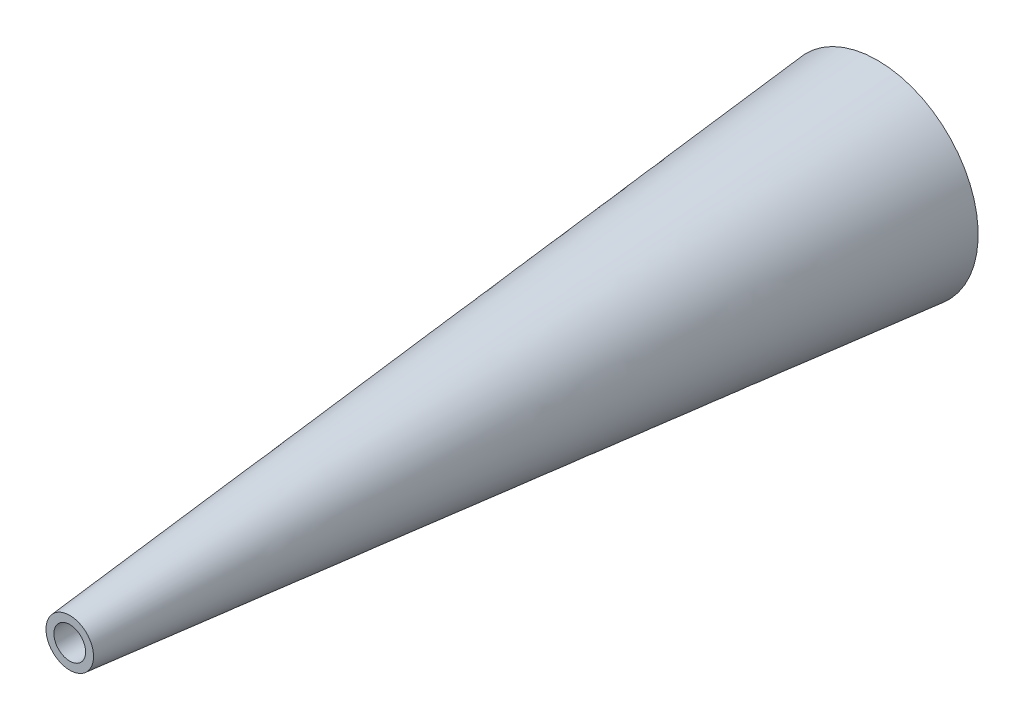
ISO-10303-21;
HEADER;
FILE_DESCRIPTION(('STEP AP214'),'2;1');
FILE_NAME('part.step','',(''),(''),'','','');
FILE_SCHEMA(('AUTOMOTIVE_DESIGN { 1 0 10303 214 1 1 1 1 }'));
ENDSEC;
DATA;
#1=APPLICATION_CONTEXT('core data for automotive mechanical design processes');
#2=APPLICATION_PROTOCOL_DEFINITION('international standard','automotive_design',2000,#1);
#3=PRODUCT_CONTEXT('',#1,'mechanical');
#4=PRODUCT('Part','Part','',(#3));
#5=PRODUCT_RELATED_PRODUCT_CATEGORY('part','',(#4));
#6=PRODUCT_DEFINITION_FORMATION('','',#4);
#7=PRODUCT_DEFINITION_CONTEXT('part definition',#1,'design');
#8=PRODUCT_DEFINITION('design','',#6,#7);
#9=PRODUCT_DEFINITION_SHAPE('','',#8);
#10=(LENGTH_UNIT() NAMED_UNIT(*) SI_UNIT(.MILLI.,.METRE.));
#11=(NAMED_UNIT(*) PLANE_ANGLE_UNIT() SI_UNIT($,.RADIAN.));
#12=(NAMED_UNIT(*) SI_UNIT($,.STERADIAN.) SOLID_ANGLE_UNIT());
#13=UNCERTAINTY_MEASURE_WITH_UNIT(LENGTH_MEASURE(1.E-05),#10,'distance_accuracy_value','');
#14=(GEOMETRIC_REPRESENTATION_CONTEXT(3) GLOBAL_UNCERTAINTY_ASSIGNED_CONTEXT((#13)) GLOBAL_UNIT_ASSIGNED_CONTEXT((#10,
#11,#12)) REPRESENTATION_CONTEXT('',''));
#15=CARTESIAN_POINT('',(0.,0.,0.));
#16=DIRECTION('',(0.,0.,1.));
#17=DIRECTION('',(1.,0.,0.));
#18=AXIS2_PLACEMENT_3D('',#15,#16,#17);
#19=CARTESIAN_POINT('',(0.,0.,203.656132651637));
#20=DIRECTION('',(0.,0.,1.));
#21=DIRECTION('',(1.,0.,0.));
#22=AXIS2_PLACEMENT_3D('',#19,#20,#21);
#23=PLANE('',#22);
#24=CARTESIAN_POINT('',(0.,0.,203.656132651637));
#25=DIRECTION('',(0.,0.,1.));
#26=DIRECTION('',(1.,0.,0.));
#27=AXIS2_PLACEMENT_3D('',#24,#25,#26);
#28=CIRCLE('',#27,8.);
#29=CARTESIAN_POINT('',(8.,0.,203.656132651637));
#30=VERTEX_POINT('',#29);
#31=EDGE_CURVE('E102',#30,#30,#28,.T.);
#32=ORIENTED_EDGE('',*,*,#31,.F.);
#33=EDGE_LOOP('',(#32));
#34=FACE_BOUND('',#33,.T.);
#35=CARTESIAN_POINT('',(0.,0.,203.656132651637));
#36=DIRECTION('',(0.,0.,1.));
#37=DIRECTION('',(1.,0.,0.));
#38=AXIS2_PLACEMENT_3D('',#35,#36,#37);
#39=CIRCLE('',#38,11.9893942221651);
#40=CARTESIAN_POINT('',(0.,11.9893942221651,203.656132651637));
#41=VERTEX_POINT('',#40);
#42=EDGE_CURVE('E12',#41,#41,#39,.T.);
#43=ORIENTED_EDGE('',*,*,#42,.T.);
#44=EDGE_LOOP('',(#43));
#45=FACE_BOUND('',#44,.T.);
#46=ADVANCED_FACE('F89',(#34,#45),#23,.T.);
#47=CARTESIAN_POINT('',(0.,0.,-203.656132651637));
#48=DIRECTION('',(0.,0.,1.));
#49=DIRECTION('',(1.,0.,0.));
#50=AXIS2_PLACEMENT_3D('',#47,#48,#49);
#51=PLANE('',#50);
#52=CARTESIAN_POINT('',(0.,0.,-203.656132651637));
#53=DIRECTION('',(0.,0.,-1.));
#54=DIRECTION('',(-1.,0.,0.));
#55=AXIS2_PLACEMENT_3D('',#52,#53,#54);
#56=CIRCLE('',#55,8.);
#57=CARTESIAN_POINT('',(-8.,0.,-203.656132651637));
#58=VERTEX_POINT('',#57);
#59=EDGE_CURVE('E165',#58,#58,#56,.T.);
#60=ORIENTED_EDGE('',*,*,#59,.F.);
#61=EDGE_LOOP('',(#60));
#62=FACE_BOUND('',#61,.T.);
#63=CARTESIAN_POINT('',(0.,0.,-203.656132651637));
#64=DIRECTION('',(0.,0.,1.));
#65=DIRECTION('',(1.,0.,0.));
#66=AXIS2_PLACEMENT_3D('',#63,#64,#65);
#67=CIRCLE('',#66,50.7591243536464);
#68=CARTESIAN_POINT('',(0.,50.7591243536464,-203.656132651637));
#69=VERTEX_POINT('',#68);
#70=EDGE_CURVE('E97',#69,#69,#67,.T.);
#71=ORIENTED_EDGE('',*,*,#70,.F.);
#72=EDGE_LOOP('',(#71));
#73=FACE_BOUND('',#72,.T.);
#74=ADVANCED_FACE('F121',(#62,#73),#51,.F.);
#75=CARTESIAN_POINT('',(0.,50.7591243536464,-203.656132651637));
#76=CARTESIAN_POINT('',(0.,37.8358809764859,-67.8853775505457));
#77=CARTESIAN_POINT('',(0.,24.9126375993255,67.8853775505456));
#78=CARTESIAN_POINT('',(0.,11.9893942221651,203.656132651637));
#79=CARTESIAN_POINT('',(-3.32217689374067,50.7591243536464,-203.656132651637));
#80=CARTESIAN_POINT('',(-2.47635259936028,37.8358809764859,-67.8853775505457));
#81=CARTESIAN_POINT('',(-1.63052830497989,24.9126375993255,67.8853775505456));
#82=CARTESIAN_POINT('',(-0.784704010599492,11.9893942221651,203.656132651637));
#83=CARTESIAN_POINT('',(-9.96645070870319,50.1049043488235,-203.656132651637));
#84=CARTESIAN_POINT('',(-7.42896380621113,37.3477731122388,-67.8853775505455));
#85=CARTESIAN_POINT('',(-4.89147690371907,24.590641875654,67.8853775505457));
#86=CARTESIAN_POINT('',(-2.35399000122702,11.8335106390693,203.656132651637));
#87=CARTESIAN_POINT('',(-19.5499718544848,47.1976657180629,-203.656132651637));
#88=CARTESIAN_POINT('',(-14.5727098239404,35.1815667560476,-67.8853775505456));
#89=CARTESIAN_POINT('',(-9.59544779339609,23.1654677940324,67.8853775505457));
#90=CARTESIAN_POINT('',(-4.61818576285176,11.1493688320171,203.656132651637));
#91=CARTESIAN_POINT('',(-28.3821056739208,42.476829874574,-203.656132651637));
#92=CARTESIAN_POINT('',(-21.1558308384665,31.6619682195277,-67.8853775505456));
#93=CARTESIAN_POINT('',(-13.9295560030121,20.8471065644813,67.8853775505456));
#94=CARTESIAN_POINT('',(-6.70328116755781,10.032244909435,203.656132651637));
#95=CARTESIAN_POINT('',(-36.1235715251465,36.1235478487174,-203.656132651637));
#96=CARTESIAN_POINT('',(-26.9268056746517,26.9267591093415,-67.8853775505459));
#97=CARTESIAN_POINT('',(-17.7300398241569,17.7299703699656,67.8853775505454));
#98=CARTESIAN_POINT('',(-8.53327397366214,8.53318163058977,203.656132651637));
#99=CARTESIAN_POINT('',(-42.4768159509501,28.3821070421007,-203.656132651637));
#100=CARTESIAN_POINT('',(-31.6619312804607,21.1558119463166,-67.8853775505455));
#101=CARTESIAN_POINT('',(-20.8470466099712,13.9295168505325,67.8853775505456));
#102=CARTESIAN_POINT('',(-10.0321619394817,6.70322175474844,203.656132651637));
#103=CARTESIAN_POINT('',(-47.1977115756533,19.5499292378348,-203.656132651637));
#104=CARTESIAN_POINT('',(-35.1815484360275,14.5726824673708,-67.885377550546));
#105=CARTESIAN_POINT('',(-23.1653852964017,9.59543569690677,67.8853775505454));
#106=CARTESIAN_POINT('',(-11.1492221567759,4.61818892644276,203.656132651637));
#107=CARTESIAN_POINT('',(-50.104821550738,9.96647101773351,-203.656132651637));
#108=CARTESIAN_POINT('',(-37.3477916062599,7.42894960855719,-67.8853775505455));
#109=CARTESIAN_POINT('',(-24.5907616617819,4.89142819938086,67.8853775505457));
#110=CARTESIAN_POINT('',(-11.8337317173039,2.35390679020452,203.656132651637));
#111=CARTESIAN_POINT('',(-51.0864346358612,1.00613961606655E-13,-203.656132651637));
#112=CARTESIAN_POINT('',(-38.0802393683663,0.,-67.8853775505456));
#113=CARTESIAN_POINT('',(-25.0740441008713,0.,67.8853775505458));
#114=CARTESIAN_POINT('',(-12.0678488333764,0.,203.656132651637));
#115=CARTESIAN_POINT('',(-50.1048215507379,-9.96647101773343,-203.656132651637));
#116=CARTESIAN_POINT('',(-37.3477916062599,-7.42894960855712,-67.8853775505458));
#117=CARTESIAN_POINT('',(-24.5907616617819,-4.89142819938082,67.8853775505455));
#118=CARTESIAN_POINT('',(-11.8337317173039,-2.35390679020451,203.656132651637));
#119=CARTESIAN_POINT('',(-47.1977115756535,-19.5499292378346,-203.656132651637));
#120=CARTESIAN_POINT('',(-35.1815484360276,-14.5726824673707,-67.8853775505461));
#121=CARTESIAN_POINT('',(-23.1653852964018,-9.59543569690672,67.8853775505452));
#122=CARTESIAN_POINT('',(-11.1492221567759,-4.61818892644276,203.656132651636));
#123=CARTESIAN_POINT('',(-42.47681595095,-28.3821070421007,-203.656132651637));
#124=CARTESIAN_POINT('',(-31.6619312804606,-21.1558119463166,-67.8853775505455));
#125=CARTESIAN_POINT('',(-20.8470466099712,-13.9295168505325,67.8853775505457));
#126=CARTESIAN_POINT('',(-10.0321619394818,-6.70322175474843,203.656132651637));
#127=CARTESIAN_POINT('',(-36.1235715251467,-36.1235478487172,-203.656132651637));
#128=CARTESIAN_POINT('',(-26.9268056746518,-26.9267591093414,-67.8853775505457));
#129=CARTESIAN_POINT('',(-17.730039824157,-17.7299703699656,67.8853775505458));
#130=CARTESIAN_POINT('',(-8.53327397366217,-8.53318163058976,203.656132651637));
#131=CARTESIAN_POINT('',(-28.3821056739208,-42.4768298745741,-203.656132651637));
#132=CARTESIAN_POINT('',(-21.1558308384665,-31.6619682195277,-67.8853775505457));
#133=CARTESIAN_POINT('',(-13.9295560030121,-20.8471065644813,67.8853775505456));
#134=CARTESIAN_POINT('',(-6.70328116755782,-10.032244909435,203.656132651637));
#135=CARTESIAN_POINT('',(-19.5499718544849,-47.1976657180628,-203.656132651637));
#136=CARTESIAN_POINT('',(-14.5727098239405,-35.1815667560476,-67.8853775505455));
#137=CARTESIAN_POINT('',(-9.59544779339614,-23.1654677940323,67.8853775505455));
#138=CARTESIAN_POINT('',(-4.61818576285176,-11.1493688320171,203.656132651637));
#139=CARTESIAN_POINT('',(-9.96645070870319,-50.1049043488236,-203.656132651637));
#140=CARTESIAN_POINT('',(-7.42896380621113,-37.3477731122388,-67.885377550546));
#141=CARTESIAN_POINT('',(-4.89147690371907,-24.5906418756541,67.8853775505454));
#142=CARTESIAN_POINT('',(-2.35399000122702,-11.8335106390693,203.656132651637));
#143=CARTESIAN_POINT('',(-3.32217689374069,-50.7591243536464,-203.656132651637));
#144=CARTESIAN_POINT('',(-2.47635259936029,-37.8358809764859,-67.8853775505457));
#145=CARTESIAN_POINT('',(-1.63052830497989,-24.9126375993255,67.8853775505456));
#146=CARTESIAN_POINT('',(-0.784704010599495,-11.9893942221651,203.656132651637));
#147=CARTESIAN_POINT('',(3.32217689374067,-50.7591243536464,-203.656132651637));
#148=CARTESIAN_POINT('',(2.47635259936028,-37.8358809764859,-67.8853775505457));
#149=CARTESIAN_POINT('',(1.63052830497988,-24.9126375993255,67.8853775505456));
#150=CARTESIAN_POINT('',(0.784704010599491,-11.9893942221651,203.656132651637));
#151=CARTESIAN_POINT('',(9.96645070870314,-50.1049043488236,-203.656132651637));
#152=CARTESIAN_POINT('',(7.4289638062111,-37.3477731122388,-67.8853775505454));
#153=CARTESIAN_POINT('',(4.89147690371906,-24.5906418756541,67.8853775505457));
#154=CARTESIAN_POINT('',(2.35399000122702,-11.8335106390693,203.656132651637));
#155=CARTESIAN_POINT('',(19.5499718544848,-47.1976657180628,-203.656132651637));
#156=CARTESIAN_POINT('',(14.5727098239405,-35.1815667560476,-67.8853775505457));
#157=CARTESIAN_POINT('',(9.59544779339611,-23.1654677940323,67.8853775505456));
#158=CARTESIAN_POINT('',(4.61818576285176,-11.1493688320171,203.656132651637));
#159=CARTESIAN_POINT('',(28.3821056739208,-42.4768298745741,-203.656132651637));
#160=CARTESIAN_POINT('',(21.1558308384664,-31.6619682195277,-67.8853775505457));
#161=CARTESIAN_POINT('',(13.9295560030121,-20.8471065644813,67.8853775505455));
#162=CARTESIAN_POINT('',(6.70328116755781,-10.032244909435,203.656132651637));
#163=CARTESIAN_POINT('',(36.1235715251465,-36.1235478487172,-203.656132651637));
#164=CARTESIAN_POINT('',(26.9268056746517,-26.9267591093414,-67.8853775505456));
#165=CARTESIAN_POINT('',(17.7300398241569,-17.7299703699656,67.8853775505456));
#166=CARTESIAN_POINT('',(8.53327397366214,-8.53318163058977,203.656132651637));
#167=CARTESIAN_POINT('',(42.4768159509501,-28.3821070421008,-203.656132651637));
#168=CARTESIAN_POINT('',(31.6619312804606,-21.1558119463167,-67.8853775505457));
#169=CARTESIAN_POINT('',(20.8470466099712,-13.9295168505326,67.8853775505456));
#170=CARTESIAN_POINT('',(10.0321619394817,-6.70322175474843,203.656132651637));
#171=CARTESIAN_POINT('',(47.1977115756533,-19.5499292378347,-203.656132651637));
#172=CARTESIAN_POINT('',(35.1815484360275,-14.5726824673707,-67.8853775505459));
#173=CARTESIAN_POINT('',(23.1653852964017,-9.59543569690672,67.8853775505455));
#174=CARTESIAN_POINT('',(11.1492221567759,-4.61818892644276,203.656132651637));
#175=CARTESIAN_POINT('',(50.1048215507379,-9.96647101773359,-203.656132651636));
#176=CARTESIAN_POINT('',(37.3477916062599,-7.42894960855724,-67.8853775505452));
#177=CARTESIAN_POINT('',(24.5907616617819,-4.89142819938088,67.8853775505459));
#178=CARTESIAN_POINT('',(11.8337317173039,-2.35390679020453,203.656132651637));
#179=CARTESIAN_POINT('',(51.0864346358614,0.,-203.656132651637));
#180=CARTESIAN_POINT('',(38.0802393683664,0.,-67.885377550546));
#181=CARTESIAN_POINT('',(25.0740441008714,0.,67.8853775505454));
#182=CARTESIAN_POINT('',(12.0678488333764,0.,203.656132651637));
#183=CARTESIAN_POINT('',(50.1048215507378,9.96647101773342,-203.656132651637));
#184=CARTESIAN_POINT('',(37.3477916062599,7.42894960855711,-67.8853775505455));
#185=CARTESIAN_POINT('',(24.5907616617819,4.89142819938081,67.8853775505457));
#186=CARTESIAN_POINT('',(11.8337317173039,2.35390679020451,203.656132651637));
#187=CARTESIAN_POINT('',(47.1977115756535,19.5499292378346,-203.656132651638));
#188=CARTESIAN_POINT('',(35.1815484360276,14.5726824673707,-67.885377550546));
#189=CARTESIAN_POINT('',(23.1653852964017,9.59543569690672,67.8853775505455));
#190=CARTESIAN_POINT('',(11.1492221567759,4.61818892644275,203.656132651637));
#191=CARTESIAN_POINT('',(42.47681595095,28.3821070421007,-203.656132651637));
#192=CARTESIAN_POINT('',(31.6619312804606,21.1558119463166,-67.8853775505455));
#193=CARTESIAN_POINT('',(20.8470466099712,13.9295168505325,67.8853775505457));
#194=CARTESIAN_POINT('',(10.0321619394817,6.70322175474843,203.656132651637));
#195=CARTESIAN_POINT('',(36.1235715251466,36.1235478487172,-203.656132651637));
#196=CARTESIAN_POINT('',(26.9268056746518,26.9267591093414,-67.8853775505457));
#197=CARTESIAN_POINT('',(17.730039824157,17.7299703699656,67.8853775505456));
#198=CARTESIAN_POINT('',(8.53327397366217,8.53318163058976,203.656132651637));
#199=CARTESIAN_POINT('',(28.3821056739208,42.476829874574,-203.656132651637));
#200=CARTESIAN_POINT('',(21.1558308384665,31.6619682195277,-67.8853775505457));
#201=CARTESIAN_POINT('',(13.9295560030121,20.8471065644813,67.8853775505455));
#202=CARTESIAN_POINT('',(6.70328116755782,10.032244909435,203.656132651637));
#203=CARTESIAN_POINT('',(19.5499718544849,47.1976657180629,-203.656132651637));
#204=CARTESIAN_POINT('',(14.5727098239405,35.1815667560477,-67.8853775505459));
#205=CARTESIAN_POINT('',(9.59544779339612,23.1654677940324,67.8853775505455));
#206=CARTESIAN_POINT('',(4.61818576285175,11.1493688320171,203.656132651637));
#207=CARTESIAN_POINT('',(9.96645070870316,50.1049043488235,-203.656132651637));
#208=CARTESIAN_POINT('',(7.42896380621111,37.3477731122387,-67.8853775505455));
#209=CARTESIAN_POINT('',(4.89147690371906,24.590641875654,67.8853775505457));
#210=CARTESIAN_POINT('',(2.35399000122701,11.8335106390693,203.656132651637));
#211=CARTESIAN_POINT('',(3.32217689374068,50.7591243536464,-203.656132651637));
#212=CARTESIAN_POINT('',(2.47635259936028,37.8358809764859,-67.8853775505457));
#213=CARTESIAN_POINT('',(1.63052830497989,24.9126375993255,67.8853775505456));
#214=CARTESIAN_POINT('',(0.784704010599494,11.9893942221651,203.656132651637));
#215=CARTESIAN_POINT('',(0.,50.7591243536464,-203.656132651637));
#216=CARTESIAN_POINT('',(0.,37.8358809764859,-67.8853775505457));
#217=CARTESIAN_POINT('',(0.,24.9126375993255,67.8853775505456));
#218=CARTESIAN_POINT('',(0.,11.9893942221651,203.656132651637));
#219=B_SPLINE_SURFACE_WITH_KNOTS('',3,3,((#75,#76,#77,#78),(#79,#80,#81,#82),(#83,#84,#85,#86),
(#87,#88,#89,#90),(#91,#92,#93,#94),(#95,#96,#97,#98),(#99,#100,#101,#102),(#103,#104,#105,
#106),(#107,#108,#109,#110),(#111,#112,#113,#114),(#115,#116,#117,#118),(#119,#120,#121,#122),
(#123,#124,#125,#126),(#127,#128,#129,#130),(#131,#132,#133,#134),(#135,#136,#137,#138),(#139,
#140,#141,#142),(#143,#144,#145,#146),(#147,#148,#149,#150),(#151,#152,#153,#154),(#155,#156,
#157,#158),(#159,#160,#161,#162),(#163,#164,#165,#166),(#167,#168,#169,#170),(#171,#172,#173,
#174),(#175,#176,#177,#178),(#179,#180,#181,#182),(#183,#184,#185,#186),(#187,#188,#189,#190),
(#191,#192,#193,#194),(#195,#196,#197,#198),(#199,#200,#201,#202),(#203,#204,#205,#206),(#207,
#208,#209,#210),(#211,#212,#213,#214),(#215,#216,#217,#218)),.UNSPECIFIED.,.T.,.F.,.F.,(4,1,1,1,
1,1,1,1,1,1,1,1,1,1,1,1,2,1,1,1,1,1,1,1,1,1,1,1,1,1,1,1,4),(4,4),(0.,0.03125,0.0625,0.09375,
0.125,0.15625,0.1875,0.21875,0.25,0.28125,0.3125,0.34375,0.375,0.40625,0.4375,0.46875,0.5,
0.53125,0.5625,0.59375,0.625,0.65625,0.6875,0.71875,0.75,0.78125,0.8125,0.84375,0.875,0.90625,
0.9375,0.96875,1.),(0.,1.),.UNSPECIFIED.);
#220=CARTESIAN_POINT('',(0.,50.7591243536464,-203.656132651637));
#221=CARTESIAN_POINT('',(0.,50.3552729981101,-199.413296554728));
#222=CARTESIAN_POINT('',(0.,49.9514216425738,-195.170460457819));
#223=CARTESIAN_POINT('',(0.,49.1437189315013,-186.684788264001));
#224=CARTESIAN_POINT('',(0.,48.739867575965,-182.441952167092));
#225=CARTESIAN_POINT('',(0.,47.9321648648925,-173.956279973273));
#226=CARTESIAN_POINT('',(0.,47.5283135093563,-169.713443876364));
#227=CARTESIAN_POINT('',(0.,46.7206107982837,-161.227771682546));
#228=CARTESIAN_POINT('',(0.,46.3167594427475,-156.984935585637));
#229=CARTESIAN_POINT('',(0.,45.5090567316749,-148.499263391819));
#230=CARTESIAN_POINT('',(0.,45.1052053761387,-144.25642729491));
#231=CARTESIAN_POINT('',(0.,44.2975026650661,-135.770755101091));
#232=CARTESIAN_POINT('',(0.,43.8936513095299,-131.527919004182));
#233=CARTESIAN_POINT('',(0.,43.0859485984573,-123.042246810364));
#234=CARTESIAN_POINT('',(0.,42.6820972429211,-118.799410713455));
#235=CARTESIAN_POINT('',(0.,41.8743945318486,-110.313738519637));
#236=CARTESIAN_POINT('',(0.,41.4705431763123,-106.070902422728));
#237=CARTESIAN_POINT('',(0.,40.6628404652398,-97.5852302289094));
#238=CARTESIAN_POINT('',(0.,40.2589891097035,-93.3423941320003));
#239=CARTESIAN_POINT('',(0.,39.451286398631,-84.8567219381821));
#240=CARTESIAN_POINT('',(0.,39.0474350430947,-80.613885841273));
#241=CARTESIAN_POINT('',(0.,38.2397323320222,-72.1282136474548));
#242=CARTESIAN_POINT('',(0.,37.8358809764859,-67.8853775505457));
#243=CARTESIAN_POINT('',(0.,37.0281782654134,-59.3997053567275));
#244=CARTESIAN_POINT('',(0.,36.6243269098771,-55.1568692598184));
#245=CARTESIAN_POINT('',(0.,35.8166241988046,-46.6711970660002));
#246=CARTESIAN_POINT('',(0.,35.4127728432683,-42.4283609690911));
#247=CARTESIAN_POINT('',(0.,34.6050701321958,-33.9426887752729));
#248=CARTESIAN_POINT('',(0.,34.2012187766595,-29.6998526783638));
#249=CARTESIAN_POINT('',(0.,33.393516065587,-21.2141804845456));
#250=CARTESIAN_POINT('',(0.,32.9896647100508,-16.9713443876365));
#251=CARTESIAN_POINT('',(0.,32.1819619989782,-8.48567219381826));
#252=CARTESIAN_POINT('',(0.,31.778110643442,-4.24283609690916));
#253=CARTESIAN_POINT('',(0.,30.9704079323694,4.24283609690905));
#254=CARTESIAN_POINT('',(0.,30.5665565768332,8.48567219381815));
#255=CARTESIAN_POINT('',(0.,29.7588538657607,16.9713443876363));
#256=CARTESIAN_POINT('',(0.,29.3550025102244,21.2141804845454));
#257=CARTESIAN_POINT('',(0.,28.5472997991519,29.6998526783637));
#258=CARTESIAN_POINT('',(0.,28.1434484436156,33.9426887752728));
#259=CARTESIAN_POINT('',(0.,27.3357457325431,42.428360969091));
#260=CARTESIAN_POINT('',(0.,26.9318943770068,46.6711970660001));
#261=CARTESIAN_POINT('',(0.,26.1241916659343,55.1568692598183));
#262=CARTESIAN_POINT('',(0.,25.720340310398,59.3997053567274));
#263=CARTESIAN_POINT('',(0.,24.9126375993255,67.8853775505456));
#264=CARTESIAN_POINT('',(0.,24.5087862437892,72.1282136474547));
#265=CARTESIAN_POINT('',(0.,23.7010835327167,80.6138858412729));
#266=CARTESIAN_POINT('',(0.,23.2972321771804,84.856721938182));
#267=CARTESIAN_POINT('',(0.,22.4895294661079,93.3423941320002));
#268=CARTESIAN_POINT('',(0.,22.0856781105716,97.5852302289093));
#269=CARTESIAN_POINT('',(0.,21.2779753994991,106.070902422727));
#270=CARTESIAN_POINT('',(0.,20.8741240439629,110.313738519637));
#271=CARTESIAN_POINT('',(0.,20.0664213328903,118.799410713455));
#272=CARTESIAN_POINT('',(0.,19.6625699773541,123.042246810364));
#273=CARTESIAN_POINT('',(0.,18.8548672662815,131.527919004182));
#274=CARTESIAN_POINT('',(0.,18.4510159107453,135.770755101091));
#275=CARTESIAN_POINT('',(0.,17.6433131996727,144.256427294909));
#276=CARTESIAN_POINT('',(0.,17.2394618441365,148.499263391819));
#277=CARTESIAN_POINT('',(0.,16.431759133064,156.984935585637));
#278=CARTESIAN_POINT('',(0.,16.0279077775277,161.227771682546));
#279=CARTESIAN_POINT('',(0.,15.2202050664552,169.713443876364));
#280=CARTESIAN_POINT('',(0.,14.8163537109189,173.956279973273));
#281=CARTESIAN_POINT('',(0.,14.0086509998464,182.441952167091));
#282=CARTESIAN_POINT('',(0.,13.6047996443101,186.684788264));
#283=CARTESIAN_POINT('',(0.,12.7970969332376,195.170460457819));
#284=CARTESIAN_POINT('',(0.,12.3932455777013,199.413296554728));
#285=CARTESIAN_POINT('',(0.,11.9893942221651,203.656132651637));
#286=B_SPLINE_CURVE_WITH_KNOTS('',3,(#220,#221,#222,#223,#224,#225,#226,#227,#228,#229,#230,
#231,#232,#233,#234,#235,#236,#237,#238,#239,#240,#241,#242,#243,#244,#245,#246,#247,#248,#249,
#250,#251,#252,#253,#254,#255,#256,#257,#258,#259,#260,#261,#262,#263,#264,#265,#266,#267,#268,
#269,#270,#271,#272,#273,#274,#275,#276,#277,#278,#279,#280,#281,#282,#283,#284,#285),
.UNSPECIFIED.,.F.,.F.,(4,2,2,2,2,2,2,2,2,2,2,2,2,2,2,2,2,2,2,2,2,2,2,2,2,2,2,2,2,2,2,2,4),(0.,
12.7860387361931,25.5720774723861,38.3581162085792,51.1441549447723,63.9301936809654,
76.7162324171585,89.5022711533516,102.288309889545,115.074348625738,127.860387361931,
140.646426098124,153.432464834317,166.21850357051,179.004542306703,191.790581042896,
204.576619779089,217.362658515282,230.148697251475,242.934735987669,255.720774723862,
268.506813460055,281.292852196248,294.078890932441,306.864929668634,319.650968404827,
332.43700714102,345.223045877213,358.009084613406,370.795123349599,383.581162085793,
396.367200821986,409.153239558179),.UNSPECIFIED.);
#287=EDGE_CURVE('BSEAM130',#69,#41,#286,.T.);
#288=ORIENTED_EDGE('',*,*,#70,.T.);
#289=ORIENTED_EDGE('',*,*,#42,.F.);
#290=ORIENTED_EDGE('',*,*,#287,.T.);
#291=ORIENTED_EDGE('',*,*,#287,.F.);
#292=EDGE_LOOP('',(#288,#290,#289,#291));
#293=FACE_BOUND('',#292,.T.);
#294=ADVANCED_FACE('F130',(#293),#219,.T.);
#295=CARTESIAN_POINT('',(0.,0.,213.343867348363));
#296=DIRECTION('',(0.,0.,-1.));
#297=DIRECTION('',(-1.,0.,0.));
#298=AXIS2_PLACEMENT_3D('',#295,#296,#297);
#299=CYLINDRICAL_SURFACE('',#298,8.);
#300=ORIENTED_EDGE('',*,*,#31,.T.);
#301=EDGE_LOOP('',(#300));
#302=FACE_BOUND('',#301,.T.);
#303=ORIENTED_EDGE('',*,*,#59,.T.);
#304=EDGE_LOOP('',(#303));
#305=FACE_BOUND('',#304,.T.);
#306=ADVANCED_FACE('F132',(#302,#305),#299,.F.);
#307=CLOSED_SHELL('',(#46,#74,#294,#306));
#308=MANIFOLD_SOLID_BREP('B2',#307);
#309=ADVANCED_BREP_SHAPE_REPRESENTATION('',(#18,#308),#14);
#310=SHAPE_DEFINITION_REPRESENTATION(#9,#309);
ENDSEC;
END-ISO-10303-21;
